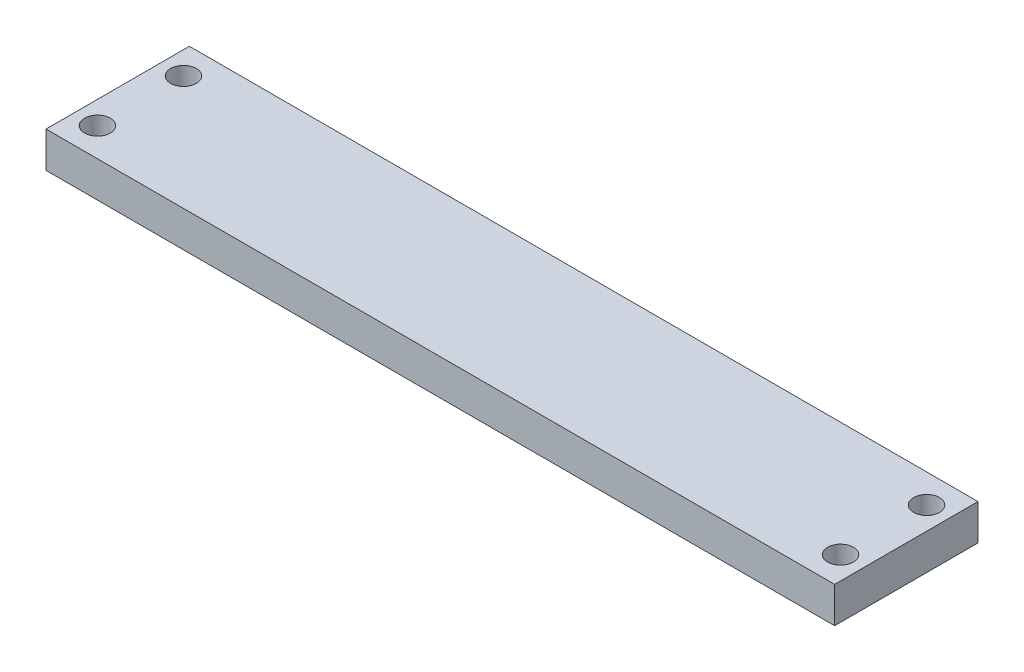
ISO-10303-21;
HEADER;
FILE_DESCRIPTION(('STEP AP214'),'2;1');
FILE_NAME('part.step','',(''),(''),'','','');
FILE_SCHEMA(('AUTOMOTIVE_DESIGN { 1 0 10303 214 1 1 1 1 }'));
ENDSEC;
DATA;
#1=APPLICATION_CONTEXT('core data for automotive mechanical design processes');
#2=APPLICATION_PROTOCOL_DEFINITION('international standard','automotive_design',2000,#1);
#3=PRODUCT_CONTEXT('',#1,'mechanical');
#4=PRODUCT('Part','Part','',(#3));
#5=PRODUCT_RELATED_PRODUCT_CATEGORY('part','',(#4));
#6=PRODUCT_DEFINITION_FORMATION('','',#4);
#7=PRODUCT_DEFINITION_CONTEXT('part definition',#1,'design');
#8=PRODUCT_DEFINITION('design','',#6,#7);
#9=PRODUCT_DEFINITION_SHAPE('','',#8);
#10=(LENGTH_UNIT() NAMED_UNIT(*) SI_UNIT(.MILLI.,.METRE.));
#11=(NAMED_UNIT(*) PLANE_ANGLE_UNIT() SI_UNIT($,.RADIAN.));
#12=(NAMED_UNIT(*) SI_UNIT($,.STERADIAN.) SOLID_ANGLE_UNIT());
#13=UNCERTAINTY_MEASURE_WITH_UNIT(LENGTH_MEASURE(1.E-05),#10,'distance_accuracy_value','');
#14=(GEOMETRIC_REPRESENTATION_CONTEXT(3) GLOBAL_UNCERTAINTY_ASSIGNED_CONTEXT((#13)) GLOBAL_UNIT_ASSIGNED_CONTEXT((#10,
#11,#12)) REPRESENTATION_CONTEXT('',''));
#15=CARTESIAN_POINT('',(0.,0.,0.));
#16=DIRECTION('',(0.,0.,1.));
#17=DIRECTION('',(1.,0.,0.));
#18=AXIS2_PLACEMENT_3D('',#15,#16,#17);
#19=CARTESIAN_POINT('',(55.,2.5,10.));
#20=DIRECTION('',(-1.,0.,0.));
#21=DIRECTION('',(0.,0.,1.));
#22=AXIS2_PLACEMENT_3D('',#19,#20,#21);
#23=PLANE('',#22);
#24=DIRECTION('',(0.,0.,-1.));
#25=VECTOR('',#24,1.);
#26=CARTESIAN_POINT('',(55.,-2.5,10.));
#27=LINE('',#26,#25);
#28=CARTESIAN_POINT('',(55.,-2.5,10.));
#29=VERTEX_POINT('',#28);
#30=CARTESIAN_POINT('',(55.,-2.5,-10.));
#31=VERTEX_POINT('',#30);
#32=EDGE_CURVE('E102',#29,#31,#27,.T.);
#33=ORIENTED_EDGE('',*,*,#32,.T.);
#34=DIRECTION('',(0.,-1.,0.));
#35=VECTOR('',#34,1.);
#36=CARTESIAN_POINT('',(55.,2.5,-10.));
#37=LINE('',#36,#35);
#38=CARTESIAN_POINT('',(55.,2.5,-10.));
#39=VERTEX_POINT('',#38);
#40=EDGE_CURVE('E11',#39,#31,#37,.T.);
#41=ORIENTED_EDGE('',*,*,#40,.F.);
#42=DIRECTION('',(0.,0.,-1.));
#43=VECTOR('',#42,1.);
#44=CARTESIAN_POINT('',(55.,2.5,10.));
#45=LINE('',#44,#43);
#46=CARTESIAN_POINT('',(55.,2.5,10.));
#47=VERTEX_POINT('',#46);
#48=EDGE_CURVE('E90',#47,#39,#45,.T.);
#49=ORIENTED_EDGE('',*,*,#48,.F.);
#50=DIRECTION('',(0.,-1.,0.));
#51=VECTOR('',#50,1.);
#52=CARTESIAN_POINT('',(55.,2.5,10.));
#53=LINE('',#52,#51);
#54=EDGE_CURVE('E98',#47,#29,#53,.T.);
#55=ORIENTED_EDGE('',*,*,#54,.T.);
#56=EDGE_LOOP('',(#33,#41,#49,#55));
#57=FACE_BOUND('',#56,.T.);
#58=ADVANCED_FACE('F39',(#57),#23,.F.);
#59=CARTESIAN_POINT('',(-55.,2.5,-10.));
#60=DIRECTION('',(0.,0.,1.));
#61=DIRECTION('',(1.,0.,0.));
#62=AXIS2_PLACEMENT_3D('',#59,#60,#61);
#63=PLANE('',#62);
#64=DIRECTION('',(-1.,0.,0.));
#65=VECTOR('',#64,1.);
#66=CARTESIAN_POINT('',(-55.,-2.5,-10.));
#67=LINE('',#66,#65);
#68=CARTESIAN_POINT('',(-55.,-2.5,-10.));
#69=VERTEX_POINT('',#68);
#70=EDGE_CURVE('E94',#31,#69,#67,.T.);
#71=ORIENTED_EDGE('',*,*,#70,.T.);
#72=DIRECTION('',(0.,-1.,0.));
#73=VECTOR('',#72,1.);
#74=CARTESIAN_POINT('',(-55.,2.5,-10.));
#75=LINE('',#74,#73);
#76=CARTESIAN_POINT('',(-55.,2.5,-10.));
#77=VERTEX_POINT('',#76);
#78=EDGE_CURVE('E47',#77,#69,#75,.T.);
#79=ORIENTED_EDGE('',*,*,#78,.F.);
#80=DIRECTION('',(-1.,0.,0.));
#81=VECTOR('',#80,1.);
#82=CARTESIAN_POINT('',(-55.,2.5,-10.));
#83=LINE('',#82,#81);
#84=EDGE_CURVE('E85',#39,#77,#83,.T.);
#85=ORIENTED_EDGE('',*,*,#84,.F.);
#86=ORIENTED_EDGE('',*,*,#40,.T.);
#87=EDGE_LOOP('',(#71,#79,#85,#86));
#88=FACE_BOUND('',#87,.T.);
#89=ADVANCED_FACE('F93',(#88),#63,.F.);
#90=CARTESIAN_POINT('',(-55.,2.5,10.));
#91=DIRECTION('',(1.,0.,0.));
#92=DIRECTION('',(0.,0.,-1.));
#93=AXIS2_PLACEMENT_3D('',#90,#91,#92);
#94=PLANE('',#93);
#95=DIRECTION('',(0.,0.,1.));
#96=VECTOR('',#95,1.);
#97=CARTESIAN_POINT('',(-55.,-2.5,10.));
#98=LINE('',#97,#96);
#99=CARTESIAN_POINT('',(-55.,-2.5,10.));
#100=VERTEX_POINT('',#99);
#101=EDGE_CURVE('E72',#69,#100,#98,.T.);
#102=ORIENTED_EDGE('',*,*,#101,.T.);
#103=DIRECTION('',(0.,-1.,0.));
#104=VECTOR('',#103,1.);
#105=CARTESIAN_POINT('',(-55.,2.5,10.));
#106=LINE('',#105,#104);
#107=CARTESIAN_POINT('',(-55.,2.5,10.));
#108=VERTEX_POINT('',#107);
#109=EDGE_CURVE('E95',#108,#100,#106,.T.);
#110=ORIENTED_EDGE('',*,*,#109,.F.);
#111=DIRECTION('',(0.,0.,1.));
#112=VECTOR('',#111,1.);
#113=CARTESIAN_POINT('',(-55.,2.5,10.));
#114=LINE('',#113,#112);
#115=EDGE_CURVE('E88',#77,#108,#114,.T.);
#116=ORIENTED_EDGE('',*,*,#115,.F.);
#117=ORIENTED_EDGE('',*,*,#78,.T.);
#118=EDGE_LOOP('',(#102,#110,#116,#117));
#119=FACE_BOUND('',#118,.T.);
#120=ADVANCED_FACE('F96',(#119),#94,.F.);
#121=CARTESIAN_POINT('',(-55.,2.5,10.));
#122=DIRECTION('',(0.,0.,-1.));
#123=DIRECTION('',(-1.,0.,0.));
#124=AXIS2_PLACEMENT_3D('',#121,#122,#123);
#125=PLANE('',#124);
#126=DIRECTION('',(1.,0.,0.));
#127=VECTOR('',#126,1.);
#128=CARTESIAN_POINT('',(-55.,-2.5,10.));
#129=LINE('',#128,#127);
#130=EDGE_CURVE('E78',#100,#29,#129,.T.);
#131=ORIENTED_EDGE('',*,*,#130,.T.);
#132=ORIENTED_EDGE('',*,*,#54,.F.);
#133=DIRECTION('',(1.,0.,0.));
#134=VECTOR('',#133,1.);
#135=CARTESIAN_POINT('',(-55.,2.5,10.));
#136=LINE('',#135,#134);
#137=EDGE_CURVE('E55',#108,#47,#136,.T.);
#138=ORIENTED_EDGE('',*,*,#137,.F.);
#139=ORIENTED_EDGE('',*,*,#109,.T.);
#140=EDGE_LOOP('',(#131,#132,#138,#139));
#141=FACE_BOUND('',#140,.T.);
#142=ADVANCED_FACE('F110',(#141),#125,.F.);
#143=CARTESIAN_POINT('',(0.,2.5,0.));
#144=DIRECTION('',(0.,-1.,0.));
#145=DIRECTION('',(0.,0.,-1.));
#146=AXIS2_PLACEMENT_3D('',#143,#144,#145);
#147=PLANE('',#146);
#148=CARTESIAN_POINT('',(-51.825,2.5,5.99999999999999));
#149=DIRECTION('',(0.,1.,0.));
#150=DIRECTION('',(0.,0.,1.));
#151=AXIS2_PLACEMENT_3D('',#148,#149,#150);
#152=CIRCLE('',#151,1.8);
#153=CARTESIAN_POINT('',(-51.825,2.5,7.79999999999999));
#154=VERTEX_POINT('',#153);
#155=EDGE_CURVE('E136',#154,#154,#152,.T.);
#156=ORIENTED_EDGE('',*,*,#155,.F.);
#157=EDGE_LOOP('',(#156));
#158=FACE_BOUND('',#157,.T.);
#159=CARTESIAN_POINT('',(51.825,2.5,5.99999999999998));
#160=DIRECTION('',(0.,1.,0.));
#161=DIRECTION('',(0.,0.,1.));
#162=AXIS2_PLACEMENT_3D('',#159,#160,#161);
#163=CIRCLE('',#162,1.8);
#164=CARTESIAN_POINT('',(51.825,2.5,7.79999999999998));
#165=VERTEX_POINT('',#164);
#166=EDGE_CURVE('E130',#165,#165,#163,.T.);
#167=ORIENTED_EDGE('',*,*,#166,.F.);
#168=EDGE_LOOP('',(#167));
#169=FACE_BOUND('',#168,.T.);
#170=CARTESIAN_POINT('',(-51.825,2.5,-5.99999999999999));
#171=DIRECTION('',(0.,1.,0.));
#172=DIRECTION('',(0.,0.,1.));
#173=AXIS2_PLACEMENT_3D('',#170,#171,#172);
#174=CIRCLE('',#173,1.8);
#175=CARTESIAN_POINT('',(-51.825,2.5,-4.19999999999999));
#176=VERTEX_POINT('',#175);
#177=EDGE_CURVE('E124',#176,#176,#174,.T.);
#178=ORIENTED_EDGE('',*,*,#177,.F.);
#179=EDGE_LOOP('',(#178));
#180=FACE_BOUND('',#179,.T.);
#181=CARTESIAN_POINT('',(51.825,2.5,-5.99999999999998));
#182=DIRECTION('',(0.,1.,0.));
#183=DIRECTION('',(0.,0.,1.));
#184=AXIS2_PLACEMENT_3D('',#181,#182,#183);
#185=CIRCLE('',#184,1.8);
#186=CARTESIAN_POINT('',(51.825,2.5,-4.19999999999998));
#187=VERTEX_POINT('',#186);
#188=EDGE_CURVE('E118',#187,#187,#185,.T.);
#189=ORIENTED_EDGE('',*,*,#188,.F.);
#190=EDGE_LOOP('',(#189));
#191=FACE_BOUND('',#190,.T.);
#192=ORIENTED_EDGE('',*,*,#48,.T.);
#193=ORIENTED_EDGE('',*,*,#84,.T.);
#194=ORIENTED_EDGE('',*,*,#115,.T.);
#195=ORIENTED_EDGE('',*,*,#137,.T.);
#196=EDGE_LOOP('',(#192,#193,#194,#195));
#197=FACE_BOUND('',#196,.T.);
#198=ADVANCED_FACE('F86',(#158,#169,#180,#191,#197),#147,.F.);
#199=CARTESIAN_POINT('',(0.,-2.5,0.));
#200=DIRECTION('',(0.,-1.,0.));
#201=DIRECTION('',(0.,0.,-1.));
#202=AXIS2_PLACEMENT_3D('',#199,#200,#201);
#203=PLANE('',#202);
#204=CARTESIAN_POINT('',(-51.825,-2.5,5.99999999999999));
#205=DIRECTION('',(0.,1.,0.));
#206=DIRECTION('',(0.,0.,1.));
#207=AXIS2_PLACEMENT_3D('',#204,#205,#206);
#208=CIRCLE('',#207,1.8);
#209=CARTESIAN_POINT('',(-51.825,-2.5,7.79999999999999));
#210=VERTEX_POINT('',#209);
#211=EDGE_CURVE('E133',#210,#210,#208,.T.);
#212=ORIENTED_EDGE('',*,*,#211,.T.);
#213=EDGE_LOOP('',(#212));
#214=FACE_BOUND('',#213,.T.);
#215=CARTESIAN_POINT('',(51.825,-2.5,5.99999999999998));
#216=DIRECTION('',(0.,1.,0.));
#217=DIRECTION('',(0.,0.,1.));
#218=AXIS2_PLACEMENT_3D('',#215,#216,#217);
#219=CIRCLE('',#218,1.8);
#220=CARTESIAN_POINT('',(51.825,-2.5,7.79999999999997));
#221=VERTEX_POINT('',#220);
#222=EDGE_CURVE('E127',#221,#221,#219,.T.);
#223=ORIENTED_EDGE('',*,*,#222,.T.);
#224=EDGE_LOOP('',(#223));
#225=FACE_BOUND('',#224,.T.);
#226=CARTESIAN_POINT('',(-51.825,-2.5,-5.99999999999999));
#227=DIRECTION('',(0.,1.,0.));
#228=DIRECTION('',(0.,0.,1.));
#229=AXIS2_PLACEMENT_3D('',#226,#227,#228);
#230=CIRCLE('',#229,1.8);
#231=CARTESIAN_POINT('',(-51.825,-2.5,-4.2));
#232=VERTEX_POINT('',#231);
#233=EDGE_CURVE('E121',#232,#232,#230,.T.);
#234=ORIENTED_EDGE('',*,*,#233,.T.);
#235=EDGE_LOOP('',(#234));
#236=FACE_BOUND('',#235,.T.);
#237=CARTESIAN_POINT('',(51.825,-2.5,-5.99999999999998));
#238=DIRECTION('',(0.,1.,0.));
#239=DIRECTION('',(0.,0.,1.));
#240=AXIS2_PLACEMENT_3D('',#237,#238,#239);
#241=CIRCLE('',#240,1.8);
#242=CARTESIAN_POINT('',(51.825,-2.5,-4.19999999999998));
#243=VERTEX_POINT('',#242);
#244=EDGE_CURVE('E105',#243,#243,#241,.T.);
#245=ORIENTED_EDGE('',*,*,#244,.T.);
#246=EDGE_LOOP('',(#245));
#247=FACE_BOUND('',#246,.T.);
#248=ORIENTED_EDGE('',*,*,#32,.F.);
#249=ORIENTED_EDGE('',*,*,#130,.F.);
#250=ORIENTED_EDGE('',*,*,#101,.F.);
#251=ORIENTED_EDGE('',*,*,#70,.F.);
#252=EDGE_LOOP('',(#248,#249,#250,#251));
#253=FACE_BOUND('',#252,.T.);
#254=ADVANCED_FACE('F113',(#214,#225,#236,#247,#253),#203,.T.);
#255=CARTESIAN_POINT('',(51.825,2.5,-5.99999999999998));
#256=DIRECTION('',(0.,1.,0.));
#257=DIRECTION('',(0.,0.,1.));
#258=AXIS2_PLACEMENT_3D('',#255,#256,#257);
#259=CYLINDRICAL_SURFACE('',#258,1.8);
#260=ORIENTED_EDGE('',*,*,#244,.F.);
#261=EDGE_LOOP('',(#260));
#262=FACE_BOUND('',#261,.T.);
#263=ORIENTED_EDGE('',*,*,#188,.T.);
#264=EDGE_LOOP('',(#263));
#265=FACE_BOUND('',#264,.T.);
#266=ADVANCED_FACE('F151',(#262,#265),#259,.F.);
#267=CARTESIAN_POINT('',(-51.825,2.5,-5.99999999999999));
#268=DIRECTION('',(0.,1.,0.));
#269=DIRECTION('',(0.,0.,1.));
#270=AXIS2_PLACEMENT_3D('',#267,#268,#269);
#271=CYLINDRICAL_SURFACE('',#270,1.8);
#272=ORIENTED_EDGE('',*,*,#233,.F.);
#273=EDGE_LOOP('',(#272));
#274=FACE_BOUND('',#273,.T.);
#275=ORIENTED_EDGE('',*,*,#177,.T.);
#276=EDGE_LOOP('',(#275));
#277=FACE_BOUND('',#276,.T.);
#278=ADVANCED_FACE('F153',(#274,#277),#271,.F.);
#279=CARTESIAN_POINT('',(51.825,2.5,5.99999999999998));
#280=DIRECTION('',(0.,1.,0.));
#281=DIRECTION('',(0.,0.,1.));
#282=AXIS2_PLACEMENT_3D('',#279,#280,#281);
#283=CYLINDRICAL_SURFACE('',#282,1.8);
#284=ORIENTED_EDGE('',*,*,#222,.F.);
#285=EDGE_LOOP('',(#284));
#286=FACE_BOUND('',#285,.T.);
#287=ORIENTED_EDGE('',*,*,#166,.T.);
#288=EDGE_LOOP('',(#287));
#289=FACE_BOUND('',#288,.T.);
#290=ADVANCED_FACE('F160',(#286,#289),#283,.F.);
#291=CARTESIAN_POINT('',(-51.825,2.5,5.99999999999999));
#292=DIRECTION('',(0.,1.,0.));
#293=DIRECTION('',(0.,0.,1.));
#294=AXIS2_PLACEMENT_3D('',#291,#292,#293);
#295=CYLINDRICAL_SURFACE('',#294,1.8);
#296=ORIENTED_EDGE('',*,*,#211,.F.);
#297=EDGE_LOOP('',(#296));
#298=FACE_BOUND('',#297,.T.);
#299=ORIENTED_EDGE('',*,*,#155,.T.);
#300=EDGE_LOOP('',(#299));
#301=FACE_BOUND('',#300,.T.);
#302=ADVANCED_FACE('F140',(#298,#301),#295,.F.);
#303=CLOSED_SHELL('',(#58,#89,#120,#142,#198,#254,#266,#278,#290,#302));
#304=MANIFOLD_SOLID_BREP('B2',#303);
#305=ADVANCED_BREP_SHAPE_REPRESENTATION('',(#18,#304),#14);
#306=SHAPE_DEFINITION_REPRESENTATION(#9,#305);
ENDSEC;
END-ISO-10303-21;
